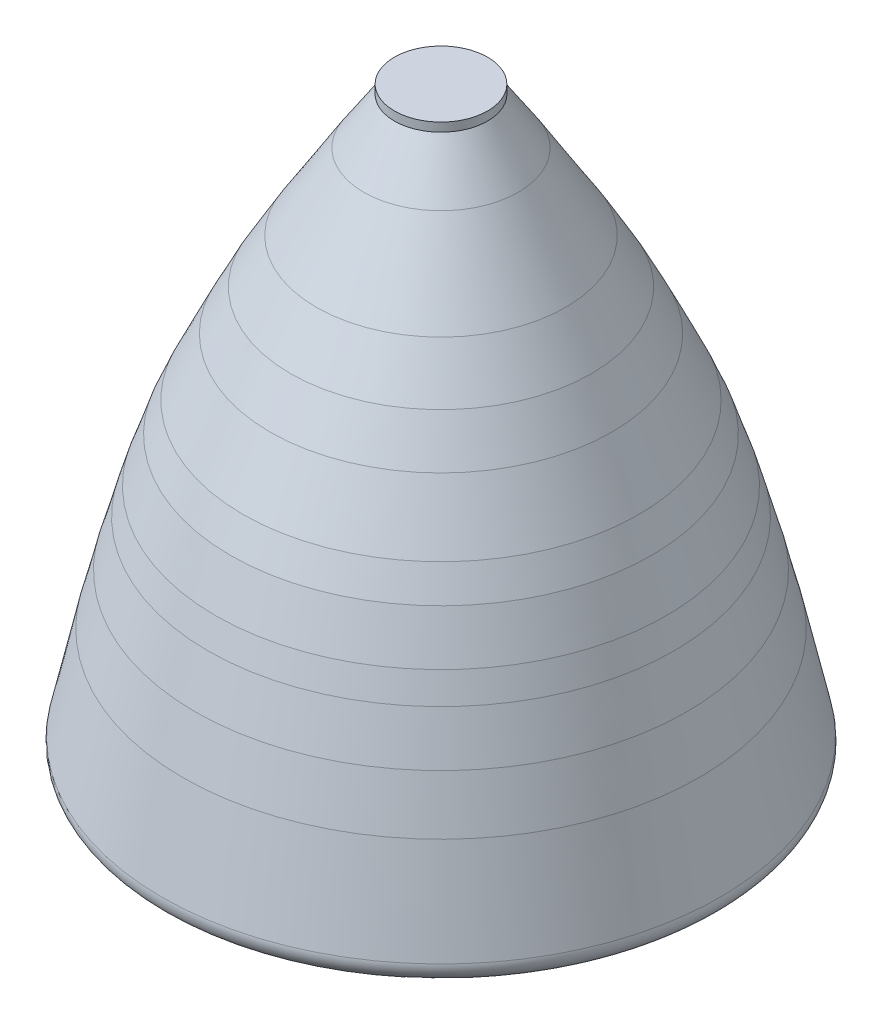
ISO-10303-21;
HEADER;
FILE_DESCRIPTION(('STEP AP214'),'2;1');
FILE_NAME('part.step','',(''),(''),'','','');
FILE_SCHEMA(('AUTOMOTIVE_DESIGN { 1 0 10303 214 1 1 1 1 }'));
ENDSEC;
DATA;
#1=APPLICATION_CONTEXT('core data for automotive mechanical design processes');
#2=APPLICATION_PROTOCOL_DEFINITION('international standard','automotive_design',2000,#1);
#3=PRODUCT_CONTEXT('',#1,'mechanical');
#4=PRODUCT('Part','Part','',(#3));
#5=PRODUCT_RELATED_PRODUCT_CATEGORY('part','',(#4));
#6=PRODUCT_DEFINITION_FORMATION('','',#4);
#7=PRODUCT_DEFINITION_CONTEXT('part definition',#1,'design');
#8=PRODUCT_DEFINITION('design','',#6,#7);
#9=PRODUCT_DEFINITION_SHAPE('','',#8);
#10=(LENGTH_UNIT() NAMED_UNIT(*) SI_UNIT(.MILLI.,.METRE.));
#11=(NAMED_UNIT(*) PLANE_ANGLE_UNIT() SI_UNIT($,.RADIAN.));
#12=(NAMED_UNIT(*) SI_UNIT($,.STERADIAN.) SOLID_ANGLE_UNIT());
#13=UNCERTAINTY_MEASURE_WITH_UNIT(LENGTH_MEASURE(1.E-05),#10,'distance_accuracy_value','');
#14=(GEOMETRIC_REPRESENTATION_CONTEXT(3) GLOBAL_UNCERTAINTY_ASSIGNED_CONTEXT((#13)) GLOBAL_UNIT_ASSIGNED_CONTEXT((#10,
#11,#12)) REPRESENTATION_CONTEXT('',''));
#15=CARTESIAN_POINT('',(0.,0.,0.));
#16=DIRECTION('',(0.,0.,1.));
#17=DIRECTION('',(1.,0.,0.));
#18=AXIS2_PLACEMENT_3D('',#15,#16,#17);
#19=CARTESIAN_POINT('',(653.389265114859,61.5472125736472,0.));
#20=DIRECTION('',(0.,1.,0.));
#21=DIRECTION('',(0.,0.,1.));
#22=AXIS2_PLACEMENT_3D('',#19,#20,#21);
#23=TOROIDAL_SURFACE('',#22,576.512971862708,35.4464729157668);
#24=CARTESIAN_POINT('',(653.389265114859,26.9356631139508,0.));
#25=DIRECTION('',(0.,1.,0.));
#26=DIRECTION('',(0.,0.,1.));
#27=AXIS2_PLACEMENT_3D('',#24,#25,#26);
#28=CIRCLE('',#27,584.161049148351);
#29=CARTESIAN_POINT('',(653.389265114859,26.9356631139508,584.161049148351));
#30=VERTEX_POINT('',#29);
#31=EDGE_CURVE('E10',#30,#30,#28,.T.);
#32=ORIENTED_EDGE('',*,*,#31,.T.);
#33=EDGE_LOOP('',(#32));
#34=FACE_BOUND('',#33,.T.);
#35=CARTESIAN_POINT('',(653.389265114859,69.1952898592909,0.));
#36=DIRECTION('',(0.,1.,0.));
#37=DIRECTION('',(0.,0.,1.));
#38=AXIS2_PLACEMENT_3D('',#35,#36,#37);
#39=CIRCLE('',#38,611.124521322404);
#40=CARTESIAN_POINT('',(653.389265114859,69.1952898592909,611.124521322404));
#41=VERTEX_POINT('',#40);
#42=EDGE_CURVE('E134',#41,#41,#39,.T.);
#43=ORIENTED_EDGE('',*,*,#42,.F.);
#44=EDGE_LOOP('',(#43));
#45=FACE_BOUND('',#44,.T.);
#46=ADVANCED_FACE('F43',(#34,#45),#23,.T.);
#47=CARTESIAN_POINT('',(653.389265114859,61.5472125736471,0.));
#48=DIRECTION('',(0.,-1.,0.));
#49=DIRECTION('',(0.,0.,-1.));
#50=AXIS2_PLACEMENT_3D('',#47,#48,#49);
#51=CONICAL_SURFACE('',#50,576.512971862708,0.217474322117007);
#52=CARTESIAN_POINT('',(653.389265114859,273.928290994149,0.));
#53=DIRECTION('',(0.,1.,0.));
#54=DIRECTION('',(0.,0.,1.));
#55=AXIS2_PLACEMENT_3D('',#52,#53,#54);
#56=CIRCLE('',#55,529.583350764415);
#57=CARTESIAN_POINT('',(653.389265114859,273.928290994149,529.583350764415));
#58=VERTEX_POINT('',#57);
#59=EDGE_CURVE('E50',#58,#58,#56,.T.);
#60=ORIENTED_EDGE('',*,*,#59,.T.);
#61=EDGE_LOOP('',(#60));
#62=FACE_BOUND('',#61,.T.);
#63=ORIENTED_EDGE('',*,*,#31,.F.);
#64=EDGE_LOOP('',(#63));
#65=FACE_BOUND('',#64,.T.);
#66=ADVANCED_FACE('F143',(#62,#65),#51,.F.);
#67=CARTESIAN_POINT('',(653.389265114859,273.928290994149,0.));
#68=DIRECTION('',(0.,-1.,0.));
#69=DIRECTION('',(0.,0.,-1.));
#70=AXIS2_PLACEMENT_3D('',#67,#68,#69);
#71=CONICAL_SURFACE('',#70,529.583350764415,0.250788758424803);
#72=CARTESIAN_POINT('',(653.389265114859,467.759415634884,0.));
#73=DIRECTION('',(0.,1.,0.));
#74=DIRECTION('',(0.,0.,1.));
#75=AXIS2_PLACEMENT_3D('',#72,#73,#74);
#76=CIRCLE('',#75,479.92725214811);
#77=CARTESIAN_POINT('',(653.389265114859,467.759415634884,479.92725214811));
#78=VERTEX_POINT('',#77);
#79=EDGE_CURVE('E55',#78,#78,#76,.T.);
#80=ORIENTED_EDGE('',*,*,#79,.T.);
#81=EDGE_LOOP('',(#80));
#82=FACE_BOUND('',#81,.T.);
#83=ORIENTED_EDGE('',*,*,#59,.F.);
#84=EDGE_LOOP('',(#83));
#85=FACE_BOUND('',#84,.T.);
#86=ADVANCED_FACE('F147',(#82,#85),#71,.F.);
#87=CARTESIAN_POINT('',(653.389265114859,467.759415634884,0.));
#88=DIRECTION('',(0.,-1.,0.));
#89=DIRECTION('',(0.,0.,-1.));
#90=AXIS2_PLACEMENT_3D('',#87,#88,#89);
#91=CONICAL_SURFACE('',#90,479.92725214811,0.345324807266969);
#92=CARTESIAN_POINT('',(653.389265114859,625.69816264368,0.));
#93=DIRECTION('',(0.,1.,0.));
#94=DIRECTION('',(0.,0.,1.));
#95=AXIS2_PLACEMENT_3D('',#92,#93,#94);
#96=CIRCLE('',#95,423.110471520696);
#97=CARTESIAN_POINT('',(653.389265114859,625.69816264368,423.110471520696));
#98=VERTEX_POINT('',#97);
#99=EDGE_CURVE('E60',#98,#98,#96,.T.);
#100=ORIENTED_EDGE('',*,*,#99,.T.);
#101=EDGE_LOOP('',(#100));
#102=FACE_BOUND('',#101,.T.);
#103=ORIENTED_EDGE('',*,*,#79,.F.);
#104=EDGE_LOOP('',(#103));
#105=FACE_BOUND('',#104,.T.);
#106=ADVANCED_FACE('F151',(#102,#105),#91,.F.);
#107=CARTESIAN_POINT('',(653.389265114859,625.69816264368,0.));
#108=DIRECTION('',(0.,-1.,0.));
#109=DIRECTION('',(0.,0.,-1.));
#110=AXIS2_PLACEMENT_3D('',#107,#108,#109);
#111=CONICAL_SURFACE('',#110,423.110471520696,0.390759156151918);
#112=CARTESIAN_POINT('',(653.389265114859,807.560462183378,0.));
#113=DIRECTION('',(0.,1.,0.));
#114=DIRECTION('',(0.,0.,1.));
#115=AXIS2_PLACEMENT_3D('',#112,#113,#114);
#116=CIRCLE('',#115,348.193639337358);
#117=CARTESIAN_POINT('',(653.389265114859,807.560462183378,348.193639337358));
#118=VERTEX_POINT('',#117);
#119=EDGE_CURVE('E66',#118,#118,#116,.T.);
#120=ORIENTED_EDGE('',*,*,#119,.T.);
#121=EDGE_LOOP('',(#120));
#122=FACE_BOUND('',#121,.T.);
#123=ORIENTED_EDGE('',*,*,#99,.F.);
#124=EDGE_LOOP('',(#123));
#125=FACE_BOUND('',#124,.T.);
#126=ADVANCED_FACE('F158',(#122,#125),#111,.F.);
#127=CARTESIAN_POINT('',(653.389265114859,807.560462183378,0.));
#128=DIRECTION('',(0.,-1.,0.));
#129=DIRECTION('',(0.,0.,-1.));
#130=AXIS2_PLACEMENT_3D('',#127,#128,#129);
#131=CONICAL_SURFACE('',#130,348.193639337358,0.481577302475753);
#132=CARTESIAN_POINT('',(653.389265114859,924.865644711691,0.));
#133=DIRECTION('',(0.,1.,0.));
#134=DIRECTION('',(0.,0.,1.));
#135=AXIS2_PLACEMENT_3D('',#132,#133,#134);
#136=CIRCLE('',#135,286.887921432543);
#137=CARTESIAN_POINT('',(653.389265114859,924.865644711691,286.887921432543));
#138=VERTEX_POINT('',#137);
#139=EDGE_CURVE('E70',#138,#138,#136,.T.);
#140=ORIENTED_EDGE('',*,*,#139,.T.);
#141=EDGE_LOOP('',(#140));
#142=FACE_BOUND('',#141,.T.);
#143=ORIENTED_EDGE('',*,*,#119,.F.);
#144=EDGE_LOOP('',(#143));
#145=FACE_BOUND('',#144,.T.);
#146=ADVANCED_FACE('F162',(#142,#145),#131,.F.);
#147=CARTESIAN_POINT('',(653.389265114859,924.865644711691,0.));
#148=DIRECTION('',(0.,-1.,0.));
#149=DIRECTION('',(0.,0.,-1.));
#150=AXIS2_PLACEMENT_3D('',#147,#148,#149);
#151=CONICAL_SURFACE('',#150,286.887921432543,0.539945520592877);
#152=CARTESIAN_POINT('',(653.389265114859,1044.85945767497,0.));
#153=DIRECTION('',(0.,1.,0.));
#154=DIRECTION('',(0.,0.,1.));
#155=AXIS2_PLACEMENT_3D('',#152,#153,#154);
#156=CIRCLE('',#155,214.968961164528);
#157=CARTESIAN_POINT('',(653.389265114859,1044.85945767497,214.968961164528));
#158=VERTEX_POINT('',#157);
#159=EDGE_CURVE('E74',#158,#158,#156,.T.);
#160=ORIENTED_EDGE('',*,*,#159,.T.);
#161=EDGE_LOOP('',(#160));
#162=FACE_BOUND('',#161,.T.);
#163=ORIENTED_EDGE('',*,*,#139,.F.);
#164=EDGE_LOOP('',(#163));
#165=FACE_BOUND('',#164,.T.);
#166=ADVANCED_FACE('F166',(#162,#165),#151,.F.);
#167=CARTESIAN_POINT('',(653.389265114859,1166.19758585574,0.));
#168=DIRECTION('',(0.,-1.,0.));
#169=DIRECTION('',(0.,0.,-1.));
#170=AXIS2_PLACEMENT_3D('',#167,#168,#169);
#171=CONICAL_SURFACE('',#170,137.743379714914,0.566790273766783);
#172=CARTESIAN_POINT('',(653.389265114859,1243.60449383544,0.));
#173=DIRECTION('',(0.,1.,0.));
#174=DIRECTION('',(0.,0.,1.));
#175=AXIS2_PLACEMENT_3D('',#172,#173,#174);
#176=CIRCLE('',#175,88.4777979346888);
#177=CARTESIAN_POINT('',(653.389265114859,1243.60449383544,88.4777979346888));
#178=VERTEX_POINT('',#177);
#179=EDGE_CURVE('E78',#178,#178,#176,.T.);
#180=ORIENTED_EDGE('',*,*,#179,.T.);
#181=EDGE_LOOP('',(#180));
#182=FACE_BOUND('',#181,.T.);
#183=ORIENTED_EDGE('',*,*,#159,.F.);
#184=EDGE_LOOP('',(#183));
#185=FACE_BOUND('',#184,.T.);
#186=ADVANCED_FACE('F170',(#182,#185),#171,.F.);
#187=CARTESIAN_POINT('',(653.389265114859,1243.60449383544,0.));
#188=DIRECTION('',(0.,-1.,0.));
#189=DIRECTION('',(0.,0.,-1.));
#190=AXIS2_PLACEMENT_3D('',#187,#188,#189);
#191=CONICAL_SURFACE('',#190,88.4777979346888,0.641532370260309);
#192=CARTESIAN_POINT('',(653.389265114859,1287.55294452349,0.));
#193=DIRECTION('',(0.,1.,0.));
#194=DIRECTION('',(0.,0.,1.));
#195=AXIS2_PLACEMENT_3D('',#192,#193,#194);
#196=CIRCLE('',#195,55.6514529690679);
#197=CARTESIAN_POINT('',(653.389265114859,1287.55294452349,55.6514529690679));
#198=VERTEX_POINT('',#197);
#199=EDGE_CURVE('E82',#198,#198,#196,.T.);
#200=ORIENTED_EDGE('',*,*,#199,.T.);
#201=EDGE_LOOP('',(#200));
#202=FACE_BOUND('',#201,.T.);
#203=ORIENTED_EDGE('',*,*,#179,.F.);
#204=EDGE_LOOP('',(#203));
#205=FACE_BOUND('',#204,.T.);
#206=ADVANCED_FACE('F174',(#202,#205),#191,.F.);
#207=CARTESIAN_POINT('',(597.737812145791,1287.55294452349,0.));
#208=DIRECTION('',(0.,-1.,0.));
#209=DIRECTION('',(0.,0.,-1.));
#210=AXIS2_PLACEMENT_3D('',#207,#208,#209);
#211=PLANE('',#210);
#212=ORIENTED_EDGE('',*,*,#199,.F.);
#213=EDGE_LOOP('',(#212));
#214=FACE_BOUND('',#213,.T.);
#215=ADVANCED_FACE('F178',(#214),#211,.T.);
#216=CARTESIAN_POINT('',(551.284921557034,1306.79209015607,0.));
#217=DIRECTION('',(0.,1.,0.));
#218=DIRECTION('',(0.,0.,1.));
#219=AXIS2_PLACEMENT_3D('',#216,#217,#218);
#220=PLANE('',#219);
#221=CARTESIAN_POINT('',(653.389265114859,1306.79209015607,0.));
#222=DIRECTION('',(0.,1.,0.));
#223=DIRECTION('',(0.,0.,1.));
#224=AXIS2_PLACEMENT_3D('',#221,#222,#223);
#225=CIRCLE('',#224,102.104343557825);
#226=CARTESIAN_POINT('',(653.389265114859,1306.79209015607,102.104343557825));
#227=VERTEX_POINT('',#226);
#228=EDGE_CURVE('E86',#227,#227,#225,.T.);
#229=ORIENTED_EDGE('',*,*,#228,.T.);
#230=EDGE_LOOP('',(#229));
#231=FACE_BOUND('',#230,.T.);
#232=ADVANCED_FACE('F182',(#231),#220,.T.);
#233=CARTESIAN_POINT('',(653.389265114859,1306.79209015607,0.));
#234=DIRECTION('',(0.,1.,0.));
#235=DIRECTION('',(0.,0.,1.));
#236=AXIS2_PLACEMENT_3D('',#233,#234,#235);
#237=CYLINDRICAL_SURFACE('',#236,102.104343557825);
#238=CARTESIAN_POINT('',(653.389265114859,1287.55294452349,0.));
#239=DIRECTION('',(0.,1.,0.));
#240=DIRECTION('',(0.,0.,1.));
#241=AXIS2_PLACEMENT_3D('',#238,#239,#240);
#242=CIRCLE('',#241,102.104343557825);
#243=CARTESIAN_POINT('',(653.389265114859,1287.55294452349,102.104343557825));
#244=VERTEX_POINT('',#243);
#245=EDGE_CURVE('E90',#244,#244,#242,.T.);
#246=ORIENTED_EDGE('',*,*,#245,.T.);
#247=EDGE_LOOP('',(#246));
#248=FACE_BOUND('',#247,.T.);
#249=ORIENTED_EDGE('',*,*,#228,.F.);
#250=EDGE_LOOP('',(#249));
#251=FACE_BOUND('',#250,.T.);
#252=ADVANCED_FACE('F186',(#248,#251),#237,.T.);
#253=CARTESIAN_POINT('',(653.389265114859,1287.55294452349,0.));
#254=DIRECTION('',(0.,-1.,0.));
#255=DIRECTION('',(0.,0.,-1.));
#256=AXIS2_PLACEMENT_3D('',#253,#254,#255);
#257=CONICAL_SURFACE('',#256,102.104343557825,0.583616827641448);
#258=CARTESIAN_POINT('',(653.389265114859,1185.96914573321,0.));
#259=DIRECTION('',(0.,1.,0.));
#260=DIRECTION('',(0.,0.,1.));
#261=AXIS2_PLACEMENT_3D('',#258,#259,#260);
#262=CIRCLE('',#261,169.185213750515);
#263=CARTESIAN_POINT('',(653.389265114859,1185.96914573321,169.185213750515));
#264=VERTEX_POINT('',#263);
#265=EDGE_CURVE('E94',#264,#264,#262,.T.);
#266=ORIENTED_EDGE('',*,*,#265,.T.);
#267=EDGE_LOOP('',(#266));
#268=FACE_BOUND('',#267,.T.);
#269=ORIENTED_EDGE('',*,*,#245,.F.);
#270=EDGE_LOOP('',(#269));
#271=FACE_BOUND('',#270,.T.);
#272=ADVANCED_FACE('F190',(#268,#271),#257,.T.);
#273=CARTESIAN_POINT('',(653.389265114859,1102.65135031666,0.));
#274=DIRECTION('',(0.,-1.,0.));
#275=DIRECTION('',(0.,0.,-1.));
#276=AXIS2_PLACEMENT_3D('',#273,#274,#275);
#277=CONICAL_SURFACE('',#276,221.28432463788,0.558819273997842);
#278=CARTESIAN_POINT('',(653.389265114859,1019.68104917575,0.));
#279=DIRECTION('',(0.,1.,0.));
#280=DIRECTION('',(0.,0.,1.));
#281=AXIS2_PLACEMENT_3D('',#278,#279,#280);
#282=CIRCLE('',#281,273.166145296797);
#283=CARTESIAN_POINT('',(653.389265114859,1019.68104917575,273.166145296797));
#284=VERTEX_POINT('',#283);
#285=EDGE_CURVE('E98',#284,#284,#282,.T.);
#286=ORIENTED_EDGE('',*,*,#285,.T.);
#287=EDGE_LOOP('',(#286));
#288=FACE_BOUND('',#287,.T.);
#289=ORIENTED_EDGE('',*,*,#265,.F.);
#290=EDGE_LOOP('',(#289));
#291=FACE_BOUND('',#290,.T.);
#292=ADVANCED_FACE('F194',(#288,#291),#277,.T.);
#293=CARTESIAN_POINT('',(653.389265114859,1019.68104917575,0.));
#294=DIRECTION('',(0.,-1.,0.));
#295=DIRECTION('',(0.,0.,-1.));
#296=AXIS2_PLACEMENT_3D('',#293,#294,#295);
#297=CONICAL_SURFACE('',#296,273.166145296797,0.522803653502369);
#298=CARTESIAN_POINT('',(653.389265114859,921.947756385027,0.));
#299=DIRECTION('',(0.,1.,0.));
#300=DIRECTION('',(0.,0.,1.));
#301=AXIS2_PLACEMENT_3D('',#298,#299,#300);
#302=CIRCLE('',#301,329.48892251895);
#303=CARTESIAN_POINT('',(653.389265114859,921.947756385027,329.48892251895));
#304=VERTEX_POINT('',#303);
#305=EDGE_CURVE('E102',#304,#304,#302,.T.);
#306=ORIENTED_EDGE('',*,*,#305,.T.);
#307=EDGE_LOOP('',(#306));
#308=FACE_BOUND('',#307,.T.);
#309=ORIENTED_EDGE('',*,*,#285,.F.);
#310=EDGE_LOOP('',(#309));
#311=FACE_BOUND('',#310,.T.);
#312=ADVANCED_FACE('F198',(#308,#311),#297,.T.);
#313=CARTESIAN_POINT('',(653.389265114859,921.947756385027,0.));
#314=DIRECTION('',(0.,-1.,0.));
#315=DIRECTION('',(0.,0.,-1.));
#316=AXIS2_PLACEMENT_3D('',#313,#314,#315);
#317=CONICAL_SURFACE('',#316,329.48892251895,0.470542150895321);
#318=CARTESIAN_POINT('',(653.389265114859,833.598766481625,0.));
#319=DIRECTION('',(0.,1.,0.));
#320=DIRECTION('',(0.,0.,1.));
#321=AXIS2_PLACEMENT_3D('',#318,#319,#320);
#322=CIRCLE('',#321,374.427470740963);
#323=CARTESIAN_POINT('',(653.389265114859,833.598766481625,374.427470740963));
#324=VERTEX_POINT('',#323);
#325=EDGE_CURVE('E106',#324,#324,#322,.T.);
#326=ORIENTED_EDGE('',*,*,#325,.T.);
#327=EDGE_LOOP('',(#326));
#328=FACE_BOUND('',#327,.T.);
#329=ORIENTED_EDGE('',*,*,#305,.F.);
#330=EDGE_LOOP('',(#329));
#331=FACE_BOUND('',#330,.T.);
#332=ADVANCED_FACE('F202',(#328,#331),#317,.T.);
#333=CARTESIAN_POINT('',(653.389265114859,750.209799565884,0.));
#334=DIRECTION('',(0.,-1.,0.));
#335=DIRECTION('',(0.,0.,-1.));
#336=AXIS2_PLACEMENT_3D('',#333,#334,#335);
#337=CONICAL_SURFACE('',#336,413.813846515561,0.441260396813249);
#338=CARTESIAN_POINT('',(653.389265114859,707.312690433174,0.));
#339=DIRECTION('',(0.,1.,0.));
#340=DIRECTION('',(0.,0.,1.));
#341=AXIS2_PLACEMENT_3D('',#338,#339,#340);
#342=CIRCLE('',#341,434.075059988226);
#343=CARTESIAN_POINT('',(653.389265114859,707.312690433174,434.075059988226));
#344=VERTEX_POINT('',#343);
#345=EDGE_CURVE('E110',#344,#344,#342,.T.);
#346=ORIENTED_EDGE('',*,*,#345,.T.);
#347=EDGE_LOOP('',(#346));
#348=FACE_BOUND('',#347,.T.);
#349=ORIENTED_EDGE('',*,*,#325,.F.);
#350=EDGE_LOOP('',(#349));
#351=FACE_BOUND('',#350,.T.);
#352=ADVANCED_FACE('F206',(#348,#351),#337,.T.);
#353=CARTESIAN_POINT('',(653.389265114859,707.312690433174,0.));
#354=DIRECTION('',(0.,-1.,0.));
#355=DIRECTION('',(0.,0.,-1.));
#356=AXIS2_PLACEMENT_3D('',#353,#354,#355);
#357=CONICAL_SURFACE('',#356,434.075059988226,0.392381223719313);
#358=CARTESIAN_POINT('',(653.389265114859,642.638832597328,0.));
#359=DIRECTION('',(0.,1.,0.));
#360=DIRECTION('',(0.,0.,1.));
#361=AXIS2_PLACEMENT_3D('',#358,#359,#360);
#362=CIRCLE('',#361,460.839768061708);
#363=CARTESIAN_POINT('',(653.389265114859,642.638832597328,460.839768061708));
#364=VERTEX_POINT('',#363);
#365=EDGE_CURVE('E114',#364,#364,#362,.T.);
#366=ORIENTED_EDGE('',*,*,#365,.T.);
#367=EDGE_LOOP('',(#366));
#368=FACE_BOUND('',#367,.T.);
#369=ORIENTED_EDGE('',*,*,#345,.F.);
#370=EDGE_LOOP('',(#369));
#371=FACE_BOUND('',#370,.T.);
#372=ADVANCED_FACE('F210',(#368,#371),#357,.T.);
#373=CARTESIAN_POINT('',(653.389265114859,642.638832597328,0.));
#374=DIRECTION('',(0.,-1.,0.));
#375=DIRECTION('',(0.,0.,-1.));
#376=AXIS2_PLACEMENT_3D('',#373,#374,#375);
#377=CONICAL_SURFACE('',#376,460.839768061708,0.322163271486655);
#378=CARTESIAN_POINT('',(653.389265114859,544.665643756737,0.));
#379=DIRECTION('',(0.,1.,0.));
#380=DIRECTION('',(0.,0.,1.));
#381=AXIS2_PLACEMENT_3D('',#378,#379,#380);
#382=CIRCLE('',#381,493.542431869935);
#383=CARTESIAN_POINT('',(653.389265114859,544.665643756737,493.542431869935));
#384=VERTEX_POINT('',#383);
#385=EDGE_CURVE('E118',#384,#384,#382,.T.);
#386=ORIENTED_EDGE('',*,*,#385,.T.);
#387=EDGE_LOOP('',(#386));
#388=FACE_BOUND('',#387,.T.);
#389=ORIENTED_EDGE('',*,*,#365,.F.);
#390=EDGE_LOOP('',(#389));
#391=FACE_BOUND('',#390,.T.);
#392=ADVANCED_FACE('F214',(#388,#391),#377,.T.);
#393=CARTESIAN_POINT('',(653.389265114859,544.665643756737,0.));
#394=DIRECTION('',(0.,-1.,0.));
#395=DIRECTION('',(0.,0.,-1.));
#396=AXIS2_PLACEMENT_3D('',#393,#394,#395);
#397=CONICAL_SURFACE('',#396,493.542431869935,0.282972334638982);
#398=CARTESIAN_POINT('',(653.389265114859,486.428268909037,0.));
#399=DIRECTION('',(0.,1.,0.));
#400=DIRECTION('',(0.,0.,1.));
#401=AXIS2_PLACEMENT_3D('',#398,#399,#400);
#402=CIRCLE('',#401,510.476416052571);
#403=CARTESIAN_POINT('',(653.389265114859,486.428268909037,510.476416052571));
#404=VERTEX_POINT('',#403);
#405=EDGE_CURVE('E122',#404,#404,#402,.T.);
#406=ORIENTED_EDGE('',*,*,#405,.T.);
#407=EDGE_LOOP('',(#406));
#408=FACE_BOUND('',#407,.T.);
#409=ORIENTED_EDGE('',*,*,#385,.F.);
#410=EDGE_LOOP('',(#409));
#411=FACE_BOUND('',#410,.T.);
#412=ADVANCED_FACE('F218',(#408,#411),#397,.T.);
#413=CARTESIAN_POINT('',(653.389265114859,486.428268909037,0.));
#414=DIRECTION('',(0.,-1.,0.));
#415=DIRECTION('',(0.,0.,-1.));
#416=AXIS2_PLACEMENT_3D('',#413,#414,#415);
#417=CONICAL_SURFACE('',#416,510.476416052571,0.268535559893791);
#418=CARTESIAN_POINT('',(653.389265114859,384.807052970718,0.));
#419=DIRECTION('',(0.,1.,0.));
#420=DIRECTION('',(0.,0.,1.));
#421=AXIS2_PLACEMENT_3D('',#418,#419,#420);
#422=CIRCLE('',#421,538.440762212625);
#423=CARTESIAN_POINT('',(653.389265114859,384.807052970718,538.440762212625));
#424=VERTEX_POINT('',#423);
#425=EDGE_CURVE('E126',#424,#424,#422,.T.);
#426=ORIENTED_EDGE('',*,*,#425,.T.);
#427=EDGE_LOOP('',(#426));
#428=FACE_BOUND('',#427,.T.);
#429=ORIENTED_EDGE('',*,*,#405,.F.);
#430=EDGE_LOOP('',(#429));
#431=FACE_BOUND('',#430,.T.);
#432=ADVANCED_FACE('F222',(#428,#431),#417,.T.);
#433=CARTESIAN_POINT('',(653.389265114859,384.807052970718,0.));
#434=DIRECTION('',(0.,-1.,0.));
#435=DIRECTION('',(0.,0.,-1.));
#436=AXIS2_PLACEMENT_3D('',#433,#434,#435);
#437=CONICAL_SURFACE('',#436,538.440762212625,0.242638209953355);
#438=CARTESIAN_POINT('',(653.389265114859,273.928290994149,0.));
#439=DIRECTION('',(0.,1.,0.));
#440=DIRECTION('',(0.,0.,1.));
#441=AXIS2_PLACEMENT_3D('',#438,#439,#440);
#442=CIRCLE('',#441,565.884887730602);
#443=CARTESIAN_POINT('',(653.389265114859,273.928290994149,565.884887730602));
#444=VERTEX_POINT('',#443);
#445=EDGE_CURVE('E130',#444,#444,#442,.T.);
#446=ORIENTED_EDGE('',*,*,#445,.T.);
#447=EDGE_LOOP('',(#446));
#448=FACE_BOUND('',#447,.T.);
#449=ORIENTED_EDGE('',*,*,#425,.F.);
#450=EDGE_LOOP('',(#449));
#451=FACE_BOUND('',#450,.T.);
#452=ADVANCED_FACE('F226',(#448,#451),#437,.T.);
#453=CARTESIAN_POINT('',(653.389265114859,273.928290994149,0.));
#454=DIRECTION('',(0.,-1.,0.));
#455=DIRECTION('',(0.,0.,-1.));
#456=AXIS2_PLACEMENT_3D('',#453,#454,#455);
#457=CONICAL_SURFACE('',#456,565.884887730602,0.217474322117006);
#458=ORIENTED_EDGE('',*,*,#42,.T.);
#459=EDGE_LOOP('',(#458));
#460=FACE_BOUND('',#459,.T.);
#461=ORIENTED_EDGE('',*,*,#445,.F.);
#462=EDGE_LOOP('',(#461));
#463=FACE_BOUND('',#462,.T.);
#464=ADVANCED_FACE('F139',(#460,#463),#457,.T.);
#465=CLOSED_SHELL('',(#46,#66,#86,#106,#126,#146,#166,#186,#206,#215,#232,#252,#272,#292,#312,
#332,#352,#372,#392,#412,#432,#452,#464));
#466=MANIFOLD_SOLID_BREP('B2',#465);
#467=ADVANCED_BREP_SHAPE_REPRESENTATION('',(#18,#466),#14);
#468=SHAPE_DEFINITION_REPRESENTATION(#9,#467);
ENDSEC;
END-ISO-10303-21;
